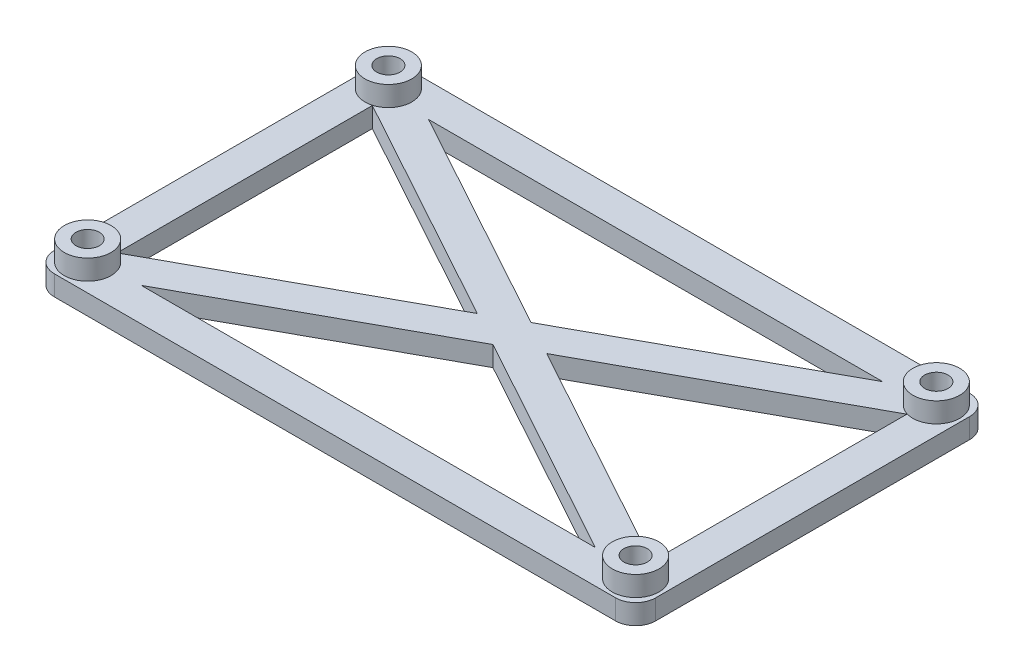
ISO-10303-21;
HEADER;
FILE_DESCRIPTION(('STEP AP214'),'2;1');
FILE_NAME('part.step','',(''),(''),'','','');
FILE_SCHEMA(('AUTOMOTIVE_DESIGN { 1 0 10303 214 1 1 1 1 }'));
ENDSEC;
DATA;
#1=APPLICATION_CONTEXT('core data for automotive mechanical design processes');
#2=APPLICATION_PROTOCOL_DEFINITION('international standard','automotive_design',2000,#1);
#3=PRODUCT_CONTEXT('',#1,'mechanical');
#4=PRODUCT('Part','Part','',(#3));
#5=PRODUCT_RELATED_PRODUCT_CATEGORY('part','',(#4));
#6=PRODUCT_DEFINITION_FORMATION('','',#4);
#7=PRODUCT_DEFINITION_CONTEXT('part definition',#1,'design');
#8=PRODUCT_DEFINITION('design','',#6,#7);
#9=PRODUCT_DEFINITION_SHAPE('','',#8);
#10=(LENGTH_UNIT() NAMED_UNIT(*) SI_UNIT(.MILLI.,.METRE.));
#11=(NAMED_UNIT(*) PLANE_ANGLE_UNIT() SI_UNIT($,.RADIAN.));
#12=(NAMED_UNIT(*) SI_UNIT($,.STERADIAN.) SOLID_ANGLE_UNIT());
#13=UNCERTAINTY_MEASURE_WITH_UNIT(LENGTH_MEASURE(1.E-05),#10,'distance_accuracy_value','');
#14=(GEOMETRIC_REPRESENTATION_CONTEXT(3) GLOBAL_UNCERTAINTY_ASSIGNED_CONTEXT((#13)) GLOBAL_UNIT_ASSIGNED_CONTEXT((#10,
#11,#12)) REPRESENTATION_CONTEXT('',''));
#15=CARTESIAN_POINT('',(0.,0.,0.));
#16=DIRECTION('',(0.,0.,1.));
#17=DIRECTION('',(1.,0.,0.));
#18=AXIS2_PLACEMENT_3D('',#15,#16,#17);
#19=CARTESIAN_POINT('',(-45.,3.,26.5));
#20=DIRECTION('',(1.,0.,0.));
#21=DIRECTION('',(0.,0.,-1.));
#22=AXIS2_PLACEMENT_3D('',#19,#20,#21);
#23=PLANE('',#22);
#24=DIRECTION('',(0.,0.,1.));
#25=VECTOR('',#24,1.);
#26=CARTESIAN_POINT('',(-45.,3.,26.5));
#27=LINE('',#26,#25);
#28=CARTESIAN_POINT('',(-45.,3.,-23.5));
#29=VERTEX_POINT('',#28);
#30=CARTESIAN_POINT('',(-45.,3.,23.5));
#31=VERTEX_POINT('',#30);
#32=EDGE_CURVE('E321',#29,#31,#27,.T.);
#33=ORIENTED_EDGE('',*,*,#32,.F.);
#34=DIRECTION('',(0.,-1.,0.));
#35=VECTOR('',#34,1.);
#36=CARTESIAN_POINT('',(-45.,3.,-23.5));
#37=LINE('',#36,#35);
#38=CARTESIAN_POINT('',(-45.,0.,-23.5));
#39=VERTEX_POINT('',#38);
#40=EDGE_CURVE('E376',#29,#39,#37,.T.);
#41=ORIENTED_EDGE('',*,*,#40,.T.);
#42=DIRECTION('',(0.,0.,1.));
#43=VECTOR('',#42,1.);
#44=CARTESIAN_POINT('',(-45.,0.,26.5));
#45=LINE('',#44,#43);
#46=CARTESIAN_POINT('',(-45.,0.,23.5));
#47=VERTEX_POINT('',#46);
#48=EDGE_CURVE('E319',#39,#47,#45,.T.);
#49=ORIENTED_EDGE('',*,*,#48,.T.);
#50=DIRECTION('',(0.,-1.,0.));
#51=VECTOR('',#50,1.);
#52=CARTESIAN_POINT('',(-45.,3.,23.5));
#53=LINE('',#52,#51);
#54=EDGE_CURVE('E372',#47,#31,#53,.F.);
#55=ORIENTED_EDGE('',*,*,#54,.T.);
#56=EDGE_LOOP('',(#33,#41,#49,#55));
#57=FACE_BOUND('',#56,.T.);
#58=ADVANCED_FACE('F50',(#57),#23,.F.);
#59=CARTESIAN_POINT('',(45.,3.,26.5));
#60=DIRECTION('',(0.,0.,-1.));
#61=DIRECTION('',(-1.,0.,0.));
#62=AXIS2_PLACEMENT_3D('',#59,#60,#61);
#63=PLANE('',#62);
#64=DIRECTION('',(1.,0.,0.));
#65=VECTOR('',#64,1.);
#66=CARTESIAN_POINT('',(45.,3.,26.5));
#67=LINE('',#66,#65);
#68=CARTESIAN_POINT('',(-42.,3.,26.5));
#69=VERTEX_POINT('',#68);
#70=CARTESIAN_POINT('',(42.,3.,26.5));
#71=VERTEX_POINT('',#70);
#72=EDGE_CURVE('E322',#69,#71,#67,.T.);
#73=ORIENTED_EDGE('',*,*,#72,.F.);
#74=DIRECTION('',(0.,-1.,0.));
#75=VECTOR('',#74,1.);
#76=CARTESIAN_POINT('',(-42.,3.,26.5));
#77=LINE('',#76,#75);
#78=CARTESIAN_POINT('',(-42.,0.,26.5));
#79=VERTEX_POINT('',#78);
#80=EDGE_CURVE('E11',#69,#79,#77,.T.);
#81=ORIENTED_EDGE('',*,*,#80,.T.);
#82=DIRECTION('',(1.,0.,0.));
#83=VECTOR('',#82,1.);
#84=CARTESIAN_POINT('',(45.,0.,26.5));
#85=LINE('',#84,#83);
#86=CARTESIAN_POINT('',(42.,0.,26.5));
#87=VERTEX_POINT('',#86);
#88=EDGE_CURVE('E333',#79,#87,#85,.T.);
#89=ORIENTED_EDGE('',*,*,#88,.T.);
#90=DIRECTION('',(0.,-1.,0.));
#91=VECTOR('',#90,1.);
#92=CARTESIAN_POINT('',(42.,3.,26.5));
#93=LINE('',#92,#91);
#94=EDGE_CURVE('E54',#87,#71,#93,.F.);
#95=ORIENTED_EDGE('',*,*,#94,.T.);
#96=EDGE_LOOP('',(#73,#81,#89,#95));
#97=FACE_BOUND('',#96,.T.);
#98=ADVANCED_FACE('F381',(#97),#63,.F.);
#99=CARTESIAN_POINT('',(45.,3.,26.5));
#100=DIRECTION('',(-1.,0.,0.));
#101=DIRECTION('',(0.,0.,1.));
#102=AXIS2_PLACEMENT_3D('',#99,#100,#101);
#103=PLANE('',#102);
#104=DIRECTION('',(0.,0.,-1.));
#105=VECTOR('',#104,1.);
#106=CARTESIAN_POINT('',(45.,0.,26.5));
#107=LINE('',#106,#105);
#108=CARTESIAN_POINT('',(45.,0.,23.5));
#109=VERTEX_POINT('',#108);
#110=CARTESIAN_POINT('',(45.,0.,-23.5));
#111=VERTEX_POINT('',#110);
#112=EDGE_CURVE('E336',#109,#111,#107,.T.);
#113=ORIENTED_EDGE('',*,*,#112,.T.);
#114=DIRECTION('',(0.,-1.,0.));
#115=VECTOR('',#114,1.);
#116=CARTESIAN_POINT('',(45.,3.,-23.5));
#117=LINE('',#116,#115);
#118=CARTESIAN_POINT('',(45.,3.,-23.5));
#119=VERTEX_POINT('',#118);
#120=EDGE_CURVE('E365',#111,#119,#117,.F.);
#121=ORIENTED_EDGE('',*,*,#120,.T.);
#122=DIRECTION('',(0.,0.,-1.));
#123=VECTOR('',#122,1.);
#124=CARTESIAN_POINT('',(45.,3.,26.5));
#125=LINE('',#124,#123);
#126=CARTESIAN_POINT('',(45.,3.,23.5));
#127=VERTEX_POINT('',#126);
#128=EDGE_CURVE('E327',#127,#119,#125,.T.);
#129=ORIENTED_EDGE('',*,*,#128,.F.);
#130=DIRECTION('',(0.,-1.,0.));
#131=VECTOR('',#130,1.);
#132=CARTESIAN_POINT('',(45.,3.,23.5));
#133=LINE('',#132,#131);
#134=EDGE_CURVE('E363',#127,#109,#133,.T.);
#135=ORIENTED_EDGE('',*,*,#134,.T.);
#136=EDGE_LOOP('',(#113,#121,#129,#135));
#137=FACE_BOUND('',#136,.T.);
#138=ADVANCED_FACE('F391',(#137),#103,.F.);
#139=CARTESIAN_POINT('',(45.,3.,-26.5));
#140=DIRECTION('',(0.,0.,1.));
#141=DIRECTION('',(1.,0.,0.));
#142=AXIS2_PLACEMENT_3D('',#139,#140,#141);
#143=PLANE('',#142);
#144=DIRECTION('',(-1.,0.,0.));
#145=VECTOR('',#144,1.);
#146=CARTESIAN_POINT('',(45.,3.,-26.5));
#147=LINE('',#146,#145);
#148=CARTESIAN_POINT('',(42.,3.,-26.5));
#149=VERTEX_POINT('',#148);
#150=CARTESIAN_POINT('',(-42.,3.,-26.5));
#151=VERTEX_POINT('',#150);
#152=EDGE_CURVE('E304',#149,#151,#147,.T.);
#153=ORIENTED_EDGE('',*,*,#152,.F.);
#154=DIRECTION('',(0.,-1.,0.));
#155=VECTOR('',#154,1.);
#156=CARTESIAN_POINT('',(42.,3.,-26.5));
#157=LINE('',#156,#155);
#158=CARTESIAN_POINT('',(42.,0.,-26.5));
#159=VERTEX_POINT('',#158);
#160=EDGE_CURVE('E348',#149,#159,#157,.T.);
#161=ORIENTED_EDGE('',*,*,#160,.T.);
#162=DIRECTION('',(-1.,0.,0.));
#163=VECTOR('',#162,1.);
#164=CARTESIAN_POINT('',(45.,0.,-26.5));
#165=LINE('',#164,#163);
#166=CARTESIAN_POINT('',(-42.,0.,-26.5));
#167=VERTEX_POINT('',#166);
#168=EDGE_CURVE('E324',#159,#167,#165,.T.);
#169=ORIENTED_EDGE('',*,*,#168,.T.);
#170=DIRECTION('',(0.,-1.,0.));
#171=VECTOR('',#170,1.);
#172=CARTESIAN_POINT('',(-42.,3.,-26.5));
#173=LINE('',#172,#171);
#174=EDGE_CURVE('E346',#167,#151,#173,.F.);
#175=ORIENTED_EDGE('',*,*,#174,.T.);
#176=EDGE_LOOP('',(#153,#161,#169,#175));
#177=FACE_BOUND('',#176,.T.);
#178=ADVANCED_FACE('F401',(#177),#143,.F.);
#179=CARTESIAN_POINT('',(0.,3.,0.));
#180=DIRECTION('',(0.,1.,0.));
#181=DIRECTION('',(0.,0.,1.));
#182=AXIS2_PLACEMENT_3D('',#179,#180,#181);
#183=PLANE('',#182);
#184=DIRECTION('',(0.,0.,1.));
#185=VECTOR('',#184,1.);
#186=CARTESIAN_POINT('',(-40.,3.,0.));
#187=LINE('',#186,#185);
#188=CARTESIAN_POINT('',(-40.,3.,-19.0995094728116));
#189=VERTEX_POINT('',#188);
#190=CARTESIAN_POINT('',(-40.,3.,19.0995094728116));
#191=VERTEX_POINT('',#190);
#192=EDGE_CURVE('E273',#189,#191,#187,.T.);
#193=ORIENTED_EDGE('',*,*,#192,.F.);
#194=DIRECTION('',(-0.876666970159564,0.,-0.481097727526591));
#195=VECTOR('',#194,1.);
#196=CARTESIAN_POINT('',(-1.20274431881648,3.,2.19166742539893));
#197=LINE('',#196,#195);
#198=CARTESIAN_POINT('',(-5.19644940509895,3.,0.));
#199=VERTEX_POINT('',#198);
#200=EDGE_CURVE('E269',#199,#189,#197,.T.);
#201=ORIENTED_EDGE('',*,*,#200,.F.);
#202=DIRECTION('',(0.876666970159564,0.,-0.48109772752659));
#203=VECTOR('',#202,1.);
#204=CARTESIAN_POINT('',(-1.20274431881648,3.,-2.19166742539892));
#205=LINE('',#204,#203);
#206=EDGE_CURVE('E275',#191,#199,#205,.T.);
#207=ORIENTED_EDGE('',*,*,#206,.F.);
#208=EDGE_LOOP('',(#193,#201,#207));
#209=FACE_BOUND('',#208,.T.);
#210=DIRECTION('',(0.,0.,-1.));
#211=VECTOR('',#210,1.);
#212=CARTESIAN_POINT('',(40.,3.,0.));
#213=LINE('',#212,#211);
#214=CARTESIAN_POINT('',(40.,3.,19.0995094728116));
#215=VERTEX_POINT('',#214);
#216=CARTESIAN_POINT('',(40.,3.,-19.0995094728116));
#217=VERTEX_POINT('',#216);
#218=EDGE_CURVE('E268',#215,#217,#213,.T.);
#219=ORIENTED_EDGE('',*,*,#218,.F.);
#220=DIRECTION('',(0.876666970159564,0.,0.481097727526591));
#221=VECTOR('',#220,1.);
#222=CARTESIAN_POINT('',(1.20274431881648,3.,-2.19166742539891));
#223=LINE('',#222,#221);
#224=CARTESIAN_POINT('',(5.19644940509894,3.,0.));
#225=VERTEX_POINT('',#224);
#226=EDGE_CURVE('E262',#225,#215,#223,.T.);
#227=ORIENTED_EDGE('',*,*,#226,.F.);
#228=DIRECTION('',(-0.876666970159565,0.,0.48109772752659));
#229=VECTOR('',#228,1.);
#230=CARTESIAN_POINT('',(1.20274431881648,3.,2.19166742539892));
#231=LINE('',#230,#229);
#232=EDGE_CURVE('E266',#217,#225,#231,.T.);
#233=ORIENTED_EDGE('',*,*,#232,.F.);
#234=EDGE_LOOP('',(#219,#227,#233));
#235=FACE_BOUND('',#234,.T.);
#236=DIRECTION('',(0.876666970159565,0.,0.48109772752659));
#237=VECTOR('',#236,1.);
#238=CARTESIAN_POINT('',(1.20274431881648,3.,-2.19166742539891));
#239=LINE('',#238,#237);
#240=CARTESIAN_POINT('',(-33.9813283726789,3.,-21.5));
#241=VERTEX_POINT('',#240);
#242=CARTESIAN_POINT('',(0.,3.,-2.85171003938356));
#243=VERTEX_POINT('',#242);
#244=EDGE_CURVE('E193',#241,#243,#239,.T.);
#245=ORIENTED_EDGE('',*,*,#244,.F.);
#246=DIRECTION('',(-1.,0.,0.));
#247=VECTOR('',#246,1.);
#248=CARTESIAN_POINT('',(0.,3.,-21.5));
#249=LINE('',#248,#247);
#250=CARTESIAN_POINT('',(33.9813283726789,3.,-21.5));
#251=VERTEX_POINT('',#250);
#252=EDGE_CURVE('E259',#251,#241,#249,.T.);
#253=ORIENTED_EDGE('',*,*,#252,.F.);
#254=DIRECTION('',(0.876666970159565,0.,-0.48109772752659));
#255=VECTOR('',#254,1.);
#256=CARTESIAN_POINT('',(-1.20274431881648,3.,-2.19166742539891));
#257=LINE('',#256,#255);
#258=EDGE_CURVE('E261',#243,#251,#257,.T.);
#259=ORIENTED_EDGE('',*,*,#258,.F.);
#260=EDGE_LOOP('',(#245,#253,#259));
#261=FACE_BOUND('',#260,.T.);
#262=DIRECTION('',(1.,0.,0.));
#263=VECTOR('',#262,1.);
#264=CARTESIAN_POINT('',(0.,3.,21.5));
#265=LINE('',#264,#263);
#266=CARTESIAN_POINT('',(-33.9813283726788,3.,21.5));
#267=VERTEX_POINT('',#266);
#268=CARTESIAN_POINT('',(33.9813283726788,3.,21.5));
#269=VERTEX_POINT('',#268);
#270=EDGE_CURVE('E260',#267,#269,#265,.T.);
#271=ORIENTED_EDGE('',*,*,#270,.F.);
#272=DIRECTION('',(-0.876666970159565,0.,0.48109772752659));
#273=VECTOR('',#272,1.);
#274=CARTESIAN_POINT('',(1.20274431881648,3.,2.19166742539891));
#275=LINE('',#274,#273);
#276=CARTESIAN_POINT('',(0.,3.,2.85171003938357));
#277=VERTEX_POINT('',#276);
#278=EDGE_CURVE('E246',#277,#267,#275,.T.);
#279=ORIENTED_EDGE('',*,*,#278,.F.);
#280=DIRECTION('',(-0.876666970159565,0.,-0.48109772752659));
#281=VECTOR('',#280,1.);
#282=CARTESIAN_POINT('',(-1.20274431881648,3.,2.19166742539892));
#283=LINE('',#282,#281);
#284=EDGE_CURVE('E255',#269,#277,#283,.T.);
#285=ORIENTED_EDGE('',*,*,#284,.F.);
#286=EDGE_LOOP('',(#271,#279,#285));
#287=FACE_BOUND('',#286,.T.);
#288=CARTESIAN_POINT('',(41.,3.,22.5));
#289=DIRECTION('',(0.,1.,0.));
#290=DIRECTION('',(0.,0.,1.));
#291=AXIS2_PLACEMENT_3D('',#288,#289,#290);
#292=CIRCLE('',#291,3.5);
#293=CARTESIAN_POINT('',(41.,3.,26.));
#294=VERTEX_POINT('',#293);
#295=EDGE_CURVE('E342',#294,#294,#292,.T.);
#296=ORIENTED_EDGE('',*,*,#295,.F.);
#297=EDGE_LOOP('',(#296));
#298=FACE_BOUND('',#297,.T.);
#299=CARTESIAN_POINT('',(-41.,3.,22.5));
#300=DIRECTION('',(0.,1.,0.));
#301=DIRECTION('',(0.,0.,1.));
#302=AXIS2_PLACEMENT_3D('',#299,#300,#301);
#303=CIRCLE('',#302,3.5);
#304=CARTESIAN_POINT('',(-41.,3.,26.));
#305=VERTEX_POINT('',#304);
#306=EDGE_CURVE('E299',#305,#305,#303,.T.);
#307=ORIENTED_EDGE('',*,*,#306,.F.);
#308=EDGE_LOOP('',(#307));
#309=FACE_BOUND('',#308,.T.);
#310=CARTESIAN_POINT('',(41.,3.,-22.5));
#311=DIRECTION('',(0.,1.,0.));
#312=DIRECTION('',(0.,0.,1.));
#313=AXIS2_PLACEMENT_3D('',#310,#311,#312);
#314=CIRCLE('',#313,3.5);
#315=CARTESIAN_POINT('',(41.,3.,-19.));
#316=VERTEX_POINT('',#315);
#317=EDGE_CURVE('E300',#316,#316,#314,.T.);
#318=ORIENTED_EDGE('',*,*,#317,.F.);
#319=EDGE_LOOP('',(#318));
#320=FACE_BOUND('',#319,.T.);
#321=CARTESIAN_POINT('',(-41.,3.,-22.5));
#322=DIRECTION('',(0.,1.,0.));
#323=DIRECTION('',(0.,0.,1.));
#324=AXIS2_PLACEMENT_3D('',#321,#322,#323);
#325=CIRCLE('',#324,3.5);
#326=CARTESIAN_POINT('',(-41.,3.,-19.));
#327=VERTEX_POINT('',#326);
#328=EDGE_CURVE('E303',#327,#327,#325,.T.);
#329=ORIENTED_EDGE('',*,*,#328,.F.);
#330=EDGE_LOOP('',(#329));
#331=FACE_BOUND('',#330,.T.);
#332=ORIENTED_EDGE('',*,*,#128,.T.);
#333=CARTESIAN_POINT('',(42.,3.,-23.5));
#334=DIRECTION('',(0.,1.,0.));
#335=DIRECTION('',(0.,0.,1.));
#336=AXIS2_PLACEMENT_3D('',#333,#334,#335);
#337=CIRCLE('',#336,3.);
#338=EDGE_CURVE('E375',#119,#149,#337,.T.);
#339=ORIENTED_EDGE('',*,*,#338,.T.);
#340=ORIENTED_EDGE('',*,*,#152,.T.);
#341=CARTESIAN_POINT('',(-42.,3.,-23.5));
#342=DIRECTION('',(0.,1.,0.));
#343=DIRECTION('',(0.,0.,1.));
#344=AXIS2_PLACEMENT_3D('',#341,#342,#343);
#345=CIRCLE('',#344,3.);
#346=EDGE_CURVE('E367',#151,#29,#345,.T.);
#347=ORIENTED_EDGE('',*,*,#346,.T.);
#348=ORIENTED_EDGE('',*,*,#32,.T.);
#349=CARTESIAN_POINT('',(-42.,3.,23.5));
#350=DIRECTION('',(0.,1.,0.));
#351=DIRECTION('',(0.,0.,1.));
#352=AXIS2_PLACEMENT_3D('',#349,#350,#351);
#353=CIRCLE('',#352,3.);
#354=EDGE_CURVE('E366',#31,#69,#353,.T.);
#355=ORIENTED_EDGE('',*,*,#354,.T.);
#356=ORIENTED_EDGE('',*,*,#72,.T.);
#357=CARTESIAN_POINT('',(42.,3.,23.5));
#358=DIRECTION('',(0.,1.,0.));
#359=DIRECTION('',(0.,0.,1.));
#360=AXIS2_PLACEMENT_3D('',#357,#358,#359);
#361=CIRCLE('',#360,3.);
#362=EDGE_CURVE('E368',#71,#127,#361,.T.);
#363=ORIENTED_EDGE('',*,*,#362,.T.);
#364=EDGE_LOOP('',(#332,#339,#340,#347,#348,#355,#356,#363));
#365=FACE_BOUND('',#364,.T.);
#366=ADVANCED_FACE('F390',(#209,#235,#261,#287,#298,#309,#320,#331,#365),#183,.T.);
#367=CARTESIAN_POINT('',(0.,0.,0.));
#368=DIRECTION('',(0.,1.,0.));
#369=DIRECTION('',(0.,0.,1.));
#370=AXIS2_PLACEMENT_3D('',#367,#368,#369);
#371=PLANE('',#370);
#372=DIRECTION('',(0.876666970159564,0.,0.481097727526591));
#373=VECTOR('',#372,1.);
#374=CARTESIAN_POINT('',(-5.19644940509895,0.,0.));
#375=LINE('',#374,#373);
#376=CARTESIAN_POINT('',(-40.,0.,-19.0995094728116));
#377=VERTEX_POINT('',#376);
#378=CARTESIAN_POINT('',(-5.19644940509895,0.,0.));
#379=VERTEX_POINT('',#378);
#380=EDGE_CURVE('E224',#377,#379,#375,.T.);
#381=ORIENTED_EDGE('',*,*,#380,.F.);
#382=DIRECTION('',(0.,0.,-1.));
#383=VECTOR('',#382,1.);
#384=CARTESIAN_POINT('',(-40.,0.,-19.0995094728116));
#385=LINE('',#384,#383);
#386=CARTESIAN_POINT('',(-40.,0.,19.0995094728116));
#387=VERTEX_POINT('',#386);
#388=EDGE_CURVE('E223',#387,#377,#385,.T.);
#389=ORIENTED_EDGE('',*,*,#388,.F.);
#390=DIRECTION('',(-0.876666970159564,0.,0.48109772752659));
#391=VECTOR('',#390,1.);
#392=CARTESIAN_POINT('',(-40.,0.,19.0995094728116));
#393=LINE('',#392,#391);
#394=EDGE_CURVE('E216',#379,#387,#393,.T.);
#395=ORIENTED_EDGE('',*,*,#394,.F.);
#396=EDGE_LOOP('',(#381,#389,#395));
#397=FACE_BOUND('',#396,.T.);
#398=DIRECTION('',(-0.876666970159564,0.,-0.481097727526591));
#399=VECTOR('',#398,1.);
#400=CARTESIAN_POINT('',(40.,0.,19.0995094728116));
#401=LINE('',#400,#399);
#402=CARTESIAN_POINT('',(40.,0.,19.0995094728116));
#403=VERTEX_POINT('',#402);
#404=CARTESIAN_POINT('',(5.19644940509894,0.,0.));
#405=VERTEX_POINT('',#404);
#406=EDGE_CURVE('E232',#403,#405,#401,.T.);
#407=ORIENTED_EDGE('',*,*,#406,.F.);
#408=DIRECTION('',(0.,0.,1.));
#409=VECTOR('',#408,1.);
#410=CARTESIAN_POINT('',(40.,0.,19.0995094728116));
#411=LINE('',#410,#409);
#412=CARTESIAN_POINT('',(40.,0.,-19.0995094728116));
#413=VERTEX_POINT('',#412);
#414=EDGE_CURVE('E219',#413,#403,#411,.T.);
#415=ORIENTED_EDGE('',*,*,#414,.F.);
#416=DIRECTION('',(0.876666970159565,0.,-0.48109772752659));
#417=VECTOR('',#416,1.);
#418=CARTESIAN_POINT('',(5.19644940509894,0.,0.));
#419=LINE('',#418,#417);
#420=EDGE_CURVE('E233',#405,#413,#419,.T.);
#421=ORIENTED_EDGE('',*,*,#420,.F.);
#422=EDGE_LOOP('',(#407,#415,#421));
#423=FACE_BOUND('',#422,.T.);
#424=DIRECTION('',(1.,0.,0.));
#425=VECTOR('',#424,1.);
#426=CARTESIAN_POINT('',(33.9813283726789,0.,-21.5));
#427=LINE('',#426,#425);
#428=CARTESIAN_POINT('',(-33.9813283726789,0.,-21.5));
#429=VERTEX_POINT('',#428);
#430=CARTESIAN_POINT('',(33.9813283726789,0.,-21.5));
#431=VERTEX_POINT('',#430);
#432=EDGE_CURVE('E201',#429,#431,#427,.T.);
#433=ORIENTED_EDGE('',*,*,#432,.F.);
#434=DIRECTION('',(-0.876666970159565,0.,-0.48109772752659));
#435=VECTOR('',#434,1.);
#436=CARTESIAN_POINT('',(0.,0.,-2.85171003938356));
#437=LINE('',#436,#435);
#438=CARTESIAN_POINT('',(0.,0.,-2.85171003938356));
#439=VERTEX_POINT('',#438);
#440=EDGE_CURVE('E186',#439,#429,#437,.T.);
#441=ORIENTED_EDGE('',*,*,#440,.F.);
#442=DIRECTION('',(-0.876666970159564,0.,0.48109772752659));
#443=VECTOR('',#442,1.);
#444=CARTESIAN_POINT('',(0.,0.,-2.85171003938356));
#445=LINE('',#444,#443);
#446=EDGE_CURVE('E196',#431,#439,#445,.T.);
#447=ORIENTED_EDGE('',*,*,#446,.F.);
#448=EDGE_LOOP('',(#433,#441,#447));
#449=FACE_BOUND('',#448,.T.);
#450=DIRECTION('',(0.876666970159564,0.,-0.48109772752659));
#451=VECTOR('',#450,1.);
#452=CARTESIAN_POINT('',(-33.9813283726788,0.,21.5));
#453=LINE('',#452,#451);
#454=CARTESIAN_POINT('',(-33.9813283726788,0.,21.5));
#455=VERTEX_POINT('',#454);
#456=CARTESIAN_POINT('',(0.,0.,2.85171003938357));
#457=VERTEX_POINT('',#456);
#458=EDGE_CURVE('E239',#455,#457,#453,.T.);
#459=ORIENTED_EDGE('',*,*,#458,.F.);
#460=DIRECTION('',(-1.,0.,0.));
#461=VECTOR('',#460,1.);
#462=CARTESIAN_POINT('',(-33.9813283726788,0.,21.5));
#463=LINE('',#462,#461);
#464=CARTESIAN_POINT('',(33.9813283726788,0.,21.5));
#465=VERTEX_POINT('',#464);
#466=EDGE_CURVE('E230',#465,#455,#463,.T.);
#467=ORIENTED_EDGE('',*,*,#466,.F.);
#468=DIRECTION('',(0.876666970159564,0.,0.48109772752659));
#469=VECTOR('',#468,1.);
#470=CARTESIAN_POINT('',(33.9813283726788,0.,21.5));
#471=LINE('',#470,#469);
#472=EDGE_CURVE('E245',#457,#465,#471,.T.);
#473=ORIENTED_EDGE('',*,*,#472,.F.);
#474=EDGE_LOOP('',(#459,#467,#473));
#475=FACE_BOUND('',#474,.T.);
#476=CARTESIAN_POINT('',(-41.,0.,-22.5));
#477=DIRECTION('',(0.,-1.,0.));
#478=DIRECTION('',(0.,0.,-1.));
#479=AXIS2_PLACEMENT_3D('',#476,#477,#478);
#480=CIRCLE('',#479,1.75);
#481=CARTESIAN_POINT('',(-41.,0.,-24.25));
#482=VERTEX_POINT('',#481);
#483=EDGE_CURVE('E298',#482,#482,#480,.T.);
#484=ORIENTED_EDGE('',*,*,#483,.F.);
#485=EDGE_LOOP('',(#484));
#486=FACE_BOUND('',#485,.T.);
#487=CARTESIAN_POINT('',(-41.,0.,22.5));
#488=DIRECTION('',(0.,-1.,0.));
#489=DIRECTION('',(0.,0.,-1.));
#490=AXIS2_PLACEMENT_3D('',#487,#488,#489);
#491=CIRCLE('',#490,1.75);
#492=CARTESIAN_POINT('',(-41.,0.,20.75));
#493=VERTEX_POINT('',#492);
#494=EDGE_CURVE('E311',#493,#493,#491,.T.);
#495=ORIENTED_EDGE('',*,*,#494,.F.);
#496=EDGE_LOOP('',(#495));
#497=FACE_BOUND('',#496,.T.);
#498=CARTESIAN_POINT('',(41.,0.,22.5));
#499=DIRECTION('',(0.,-1.,0.));
#500=DIRECTION('',(0.,0.,-1.));
#501=AXIS2_PLACEMENT_3D('',#498,#499,#500);
#502=CIRCLE('',#501,1.75);
#503=CARTESIAN_POINT('',(41.,0.,20.75));
#504=VERTEX_POINT('',#503);
#505=EDGE_CURVE('E310',#504,#504,#502,.T.);
#506=ORIENTED_EDGE('',*,*,#505,.F.);
#507=EDGE_LOOP('',(#506));
#508=FACE_BOUND('',#507,.T.);
#509=CARTESIAN_POINT('',(41.,0.,-22.5));
#510=DIRECTION('',(0.,-1.,0.));
#511=DIRECTION('',(0.,0.,-1.));
#512=AXIS2_PLACEMENT_3D('',#509,#510,#511);
#513=CIRCLE('',#512,1.75);
#514=CARTESIAN_POINT('',(41.,0.,-24.25));
#515=VERTEX_POINT('',#514);
#516=EDGE_CURVE('E315',#515,#515,#513,.T.);
#517=ORIENTED_EDGE('',*,*,#516,.F.);
#518=EDGE_LOOP('',(#517));
#519=FACE_BOUND('',#518,.T.);
#520=ORIENTED_EDGE('',*,*,#168,.F.);
#521=CARTESIAN_POINT('',(42.,0.,-23.5));
#522=DIRECTION('',(0.,1.,0.));
#523=DIRECTION('',(0.,0.,1.));
#524=AXIS2_PLACEMENT_3D('',#521,#522,#523);
#525=CIRCLE('',#524,3.);
#526=EDGE_CURVE('E359',#159,#111,#525,.F.);
#527=ORIENTED_EDGE('',*,*,#526,.T.);
#528=ORIENTED_EDGE('',*,*,#112,.F.);
#529=CARTESIAN_POINT('',(42.,0.,23.5));
#530=DIRECTION('',(0.,1.,0.));
#531=DIRECTION('',(0.,0.,1.));
#532=AXIS2_PLACEMENT_3D('',#529,#530,#531);
#533=CIRCLE('',#532,3.);
#534=EDGE_CURVE('E351',#109,#87,#533,.F.);
#535=ORIENTED_EDGE('',*,*,#534,.T.);
#536=ORIENTED_EDGE('',*,*,#88,.F.);
#537=CARTESIAN_POINT('',(-42.,0.,23.5));
#538=DIRECTION('',(0.,1.,0.));
#539=DIRECTION('',(0.,0.,1.));
#540=AXIS2_PLACEMENT_3D('',#537,#538,#539);
#541=CIRCLE('',#540,3.);
#542=EDGE_CURVE('E354',#79,#47,#541,.F.);
#543=ORIENTED_EDGE('',*,*,#542,.T.);
#544=ORIENTED_EDGE('',*,*,#48,.F.);
#545=CARTESIAN_POINT('',(-42.,0.,-23.5));
#546=DIRECTION('',(0.,1.,0.));
#547=DIRECTION('',(0.,0.,1.));
#548=AXIS2_PLACEMENT_3D('',#545,#546,#547);
#549=CIRCLE('',#548,3.);
#550=EDGE_CURVE('E360',#39,#167,#549,.F.);
#551=ORIENTED_EDGE('',*,*,#550,.T.);
#552=EDGE_LOOP('',(#520,#527,#528,#535,#536,#543,#544,#551));
#553=FACE_BOUND('',#552,.T.);
#554=ADVANCED_FACE('F206',(#397,#423,#449,#475,#486,#497,#508,#519,#553),#371,.F.);
#555=CARTESIAN_POINT('',(41.,3.,-22.5));
#556=DIRECTION('',(0.,-1.,0.));
#557=DIRECTION('',(0.,0.,-1.));
#558=AXIS2_PLACEMENT_3D('',#555,#556,#557);
#559=CYLINDRICAL_SURFACE('',#558,1.75);
#560=ORIENTED_EDGE('',*,*,#516,.T.);
#561=EDGE_LOOP('',(#560));
#562=FACE_BOUND('',#561,.T.);
#563=CARTESIAN_POINT('',(41.,6.,-22.5));
#564=DIRECTION('',(0.,1.,0.));
#565=DIRECTION('',(0.,0.,1.));
#566=AXIS2_PLACEMENT_3D('',#563,#564,#565);
#567=CIRCLE('',#566,1.75);
#568=CARTESIAN_POINT('',(41.,6.,-20.75));
#569=VERTEX_POINT('',#568);
#570=EDGE_CURVE('E289',#569,#569,#567,.T.);
#571=ORIENTED_EDGE('',*,*,#570,.T.);
#572=EDGE_LOOP('',(#571));
#573=FACE_BOUND('',#572,.T.);
#574=ADVANCED_FACE('F480',(#562,#573),#559,.F.);
#575=CARTESIAN_POINT('',(41.,3.,22.5));
#576=DIRECTION('',(0.,-1.,0.));
#577=DIRECTION('',(0.,0.,-1.));
#578=AXIS2_PLACEMENT_3D('',#575,#576,#577);
#579=CYLINDRICAL_SURFACE('',#578,1.75);
#580=ORIENTED_EDGE('',*,*,#505,.T.);
#581=EDGE_LOOP('',(#580));
#582=FACE_BOUND('',#581,.T.);
#583=CARTESIAN_POINT('',(41.,6.,22.5));
#584=DIRECTION('',(0.,-1.,0.));
#585=DIRECTION('',(0.,0.,-1.));
#586=AXIS2_PLACEMENT_3D('',#583,#584,#585);
#587=CIRCLE('',#586,1.75);
#588=CARTESIAN_POINT('',(41.,6.,20.75));
#589=VERTEX_POINT('',#588);
#590=EDGE_CURVE('E280',#589,#589,#587,.T.);
#591=ORIENTED_EDGE('',*,*,#590,.F.);
#592=EDGE_LOOP('',(#591));
#593=FACE_BOUND('',#592,.T.);
#594=ADVANCED_FACE('F471',(#582,#593),#579,.F.);
#595=CARTESIAN_POINT('',(-41.,3.,22.5));
#596=DIRECTION('',(0.,-1.,0.));
#597=DIRECTION('',(0.,0.,-1.));
#598=AXIS2_PLACEMENT_3D('',#595,#596,#597);
#599=CYLINDRICAL_SURFACE('',#598,1.75);
#600=ORIENTED_EDGE('',*,*,#494,.T.);
#601=EDGE_LOOP('',(#600));
#602=FACE_BOUND('',#601,.T.);
#603=CARTESIAN_POINT('',(-41.,6.,22.5));
#604=DIRECTION('',(0.,-1.,0.));
#605=DIRECTION('',(0.,0.,-1.));
#606=AXIS2_PLACEMENT_3D('',#603,#604,#605);
#607=CIRCLE('',#606,1.75);
#608=CARTESIAN_POINT('',(-41.,6.,20.75));
#609=VERTEX_POINT('',#608);
#610=EDGE_CURVE('E277',#609,#609,#607,.T.);
#611=ORIENTED_EDGE('',*,*,#610,.F.);
#612=EDGE_LOOP('',(#611));
#613=FACE_BOUND('',#612,.T.);
#614=ADVANCED_FACE('F478',(#602,#613),#599,.F.);
#615=CARTESIAN_POINT('',(-41.,3.,-22.5));
#616=DIRECTION('',(0.,-1.,0.));
#617=DIRECTION('',(0.,0.,-1.));
#618=AXIS2_PLACEMENT_3D('',#615,#616,#617);
#619=CYLINDRICAL_SURFACE('',#618,1.75);
#620=ORIENTED_EDGE('',*,*,#483,.T.);
#621=EDGE_LOOP('',(#620));
#622=FACE_BOUND('',#621,.T.);
#623=CARTESIAN_POINT('',(-41.,6.,-22.5));
#624=DIRECTION('',(0.,1.,0.));
#625=DIRECTION('',(0.,0.,1.));
#626=AXIS2_PLACEMENT_3D('',#623,#624,#625);
#627=CIRCLE('',#626,1.75);
#628=CARTESIAN_POINT('',(-41.,6.,-20.75));
#629=VERTEX_POINT('',#628);
#630=EDGE_CURVE('E291',#629,#629,#627,.T.);
#631=ORIENTED_EDGE('',*,*,#630,.T.);
#632=EDGE_LOOP('',(#631));
#633=FACE_BOUND('',#632,.T.);
#634=ADVANCED_FACE('F473',(#622,#633),#619,.F.);
#635=CARTESIAN_POINT('',(-41.,6.,-22.5));
#636=DIRECTION('',(0.,1.,0.));
#637=DIRECTION('',(0.,0.,1.));
#638=AXIS2_PLACEMENT_3D('',#635,#636,#637);
#639=PLANE('',#638);
#640=CARTESIAN_POINT('',(-41.,6.,-22.5));
#641=DIRECTION('',(0.,1.,0.));
#642=DIRECTION('',(0.,0.,1.));
#643=AXIS2_PLACEMENT_3D('',#640,#641,#642);
#644=CIRCLE('',#643,3.5);
#645=CARTESIAN_POINT('',(-41.,6.,-19.));
#646=VERTEX_POINT('',#645);
#647=EDGE_CURVE('E282',#646,#646,#644,.T.);
#648=ORIENTED_EDGE('',*,*,#647,.T.);
#649=EDGE_LOOP('',(#648));
#650=FACE_BOUND('',#649,.T.);
#651=ORIENTED_EDGE('',*,*,#630,.F.);
#652=EDGE_LOOP('',(#651));
#653=FACE_BOUND('',#652,.T.);
#654=ADVANCED_FACE('F470',(#650,#653),#639,.T.);
#655=CARTESIAN_POINT('',(-41.,6.,-22.5));
#656=DIRECTION('',(0.,-1.,0.));
#657=DIRECTION('',(0.,0.,-1.));
#658=AXIS2_PLACEMENT_3D('',#655,#656,#657);
#659=CYLINDRICAL_SURFACE('',#658,3.5);
#660=ORIENTED_EDGE('',*,*,#647,.F.);
#661=EDGE_LOOP('',(#660));
#662=FACE_BOUND('',#661,.T.);
#663=ORIENTED_EDGE('',*,*,#328,.T.);
#664=EDGE_LOOP('',(#663));
#665=FACE_BOUND('',#664,.T.);
#666=ADVANCED_FACE('F458',(#662,#665),#659,.T.);
#667=CARTESIAN_POINT('',(41.,6.,-22.5));
#668=DIRECTION('',(0.,1.,0.));
#669=DIRECTION('',(0.,0.,1.));
#670=AXIS2_PLACEMENT_3D('',#667,#668,#669);
#671=PLANE('',#670);
#672=CARTESIAN_POINT('',(41.,6.,-22.5));
#673=DIRECTION('',(0.,1.,0.));
#674=DIRECTION('',(0.,0.,1.));
#675=AXIS2_PLACEMENT_3D('',#672,#673,#674);
#676=CIRCLE('',#675,3.5);
#677=CARTESIAN_POINT('',(41.,6.,-19.));
#678=VERTEX_POINT('',#677);
#679=EDGE_CURVE('E295',#678,#678,#676,.T.);
#680=ORIENTED_EDGE('',*,*,#679,.T.);
#681=EDGE_LOOP('',(#680));
#682=FACE_BOUND('',#681,.T.);
#683=ORIENTED_EDGE('',*,*,#570,.F.);
#684=EDGE_LOOP('',(#683));
#685=FACE_BOUND('',#684,.T.);
#686=ADVANCED_FACE('F460',(#682,#685),#671,.T.);
#687=CARTESIAN_POINT('',(41.,6.,-22.5));
#688=DIRECTION('',(0.,-1.,0.));
#689=DIRECTION('',(0.,0.,-1.));
#690=AXIS2_PLACEMENT_3D('',#687,#688,#689);
#691=CYLINDRICAL_SURFACE('',#690,3.5);
#692=ORIENTED_EDGE('',*,*,#679,.F.);
#693=EDGE_LOOP('',(#692));
#694=FACE_BOUND('',#693,.T.);
#695=ORIENTED_EDGE('',*,*,#317,.T.);
#696=EDGE_LOOP('',(#695));
#697=FACE_BOUND('',#696,.T.);
#698=ADVANCED_FACE('F452',(#694,#697),#691,.T.);
#699=CARTESIAN_POINT('',(-41.,6.,22.5));
#700=DIRECTION('',(0.,-1.,0.));
#701=DIRECTION('',(0.,0.,-1.));
#702=AXIS2_PLACEMENT_3D('',#699,#700,#701);
#703=CYLINDRICAL_SURFACE('',#702,3.5);
#704=CARTESIAN_POINT('',(-41.,6.,22.5));
#705=DIRECTION('',(0.,-1.,0.));
#706=DIRECTION('',(0.,0.,-1.));
#707=AXIS2_PLACEMENT_3D('',#704,#705,#706);
#708=CIRCLE('',#707,3.5);
#709=CARTESIAN_POINT('',(-41.,6.,19.));
#710=VERTEX_POINT('',#709);
#711=EDGE_CURVE('E283',#710,#710,#708,.T.);
#712=ORIENTED_EDGE('',*,*,#711,.T.);
#713=EDGE_LOOP('',(#712));
#714=FACE_BOUND('',#713,.T.);
#715=ORIENTED_EDGE('',*,*,#306,.T.);
#716=EDGE_LOOP('',(#715));
#717=FACE_BOUND('',#716,.T.);
#718=ADVANCED_FACE('F453',(#714,#717),#703,.T.);
#719=CARTESIAN_POINT('',(-41.,6.,22.5));
#720=DIRECTION('',(0.,1.,0.));
#721=DIRECTION('',(0.,0.,-1.));
#722=AXIS2_PLACEMENT_3D('',#719,#720,#721);
#723=PLANE('',#722);
#724=ORIENTED_EDGE('',*,*,#610,.T.);
#725=EDGE_LOOP('',(#724));
#726=FACE_BOUND('',#725,.T.);
#727=ORIENTED_EDGE('',*,*,#711,.F.);
#728=EDGE_LOOP('',(#727));
#729=FACE_BOUND('',#728,.T.);
#730=ADVANCED_FACE('F445',(#726,#729),#723,.T.);
#731=CARTESIAN_POINT('',(41.,6.,22.5));
#732=DIRECTION('',(0.,-1.,0.));
#733=DIRECTION('',(0.,0.,-1.));
#734=AXIS2_PLACEMENT_3D('',#731,#732,#733);
#735=CYLINDRICAL_SURFACE('',#734,3.5);
#736=CARTESIAN_POINT('',(41.,6.,22.5));
#737=DIRECTION('',(0.,-1.,0.));
#738=DIRECTION('',(0.,0.,-1.));
#739=AXIS2_PLACEMENT_3D('',#736,#737,#738);
#740=CIRCLE('',#739,3.5);
#741=CARTESIAN_POINT('',(41.,6.,19.));
#742=VERTEX_POINT('',#741);
#743=EDGE_CURVE('E278',#742,#742,#740,.T.);
#744=ORIENTED_EDGE('',*,*,#743,.T.);
#745=EDGE_LOOP('',(#744));
#746=FACE_BOUND('',#745,.T.);
#747=ORIENTED_EDGE('',*,*,#295,.T.);
#748=EDGE_LOOP('',(#747));
#749=FACE_BOUND('',#748,.T.);
#750=ADVANCED_FACE('F436',(#746,#749),#735,.T.);
#751=CARTESIAN_POINT('',(41.,6.,22.5));
#752=DIRECTION('',(0.,1.,0.));
#753=DIRECTION('',(0.,0.,-1.));
#754=AXIS2_PLACEMENT_3D('',#751,#752,#753);
#755=PLANE('',#754);
#756=ORIENTED_EDGE('',*,*,#590,.T.);
#757=EDGE_LOOP('',(#756));
#758=FACE_BOUND('',#757,.T.);
#759=ORIENTED_EDGE('',*,*,#743,.F.);
#760=EDGE_LOOP('',(#759));
#761=FACE_BOUND('',#760,.T.);
#762=ADVANCED_FACE('F435',(#758,#761),#755,.T.);
#763=CARTESIAN_POINT('',(42.,3.,-23.5));
#764=DIRECTION('',(0.,-1.,0.));
#765=DIRECTION('',(0.,0.,-1.));
#766=AXIS2_PLACEMENT_3D('',#763,#764,#765);
#767=CYLINDRICAL_SURFACE('',#766,3.);
#768=ORIENTED_EDGE('',*,*,#338,.F.);
#769=ORIENTED_EDGE('',*,*,#120,.F.);
#770=ORIENTED_EDGE('',*,*,#526,.F.);
#771=ORIENTED_EDGE('',*,*,#160,.F.);
#772=EDGE_LOOP('',(#768,#769,#770,#771));
#773=FACE_BOUND('',#772,.T.);
#774=ADVANCED_FACE('F397',(#773),#767,.T.);
#775=CARTESIAN_POINT('',(-42.,3.,-23.5));
#776=DIRECTION('',(0.,-1.,0.));
#777=DIRECTION('',(0.,0.,-1.));
#778=AXIS2_PLACEMENT_3D('',#775,#776,#777);
#779=CYLINDRICAL_SURFACE('',#778,3.);
#780=ORIENTED_EDGE('',*,*,#346,.F.);
#781=ORIENTED_EDGE('',*,*,#174,.F.);
#782=ORIENTED_EDGE('',*,*,#550,.F.);
#783=ORIENTED_EDGE('',*,*,#40,.F.);
#784=EDGE_LOOP('',(#780,#781,#782,#783));
#785=FACE_BOUND('',#784,.T.);
#786=ADVANCED_FACE('F407',(#785),#779,.T.);
#787=CARTESIAN_POINT('',(-42.,3.,23.5));
#788=DIRECTION('',(0.,-1.,0.));
#789=DIRECTION('',(0.,0.,-1.));
#790=AXIS2_PLACEMENT_3D('',#787,#788,#789);
#791=CYLINDRICAL_SURFACE('',#790,3.);
#792=ORIENTED_EDGE('',*,*,#354,.F.);
#793=ORIENTED_EDGE('',*,*,#54,.F.);
#794=ORIENTED_EDGE('',*,*,#542,.F.);
#795=ORIENTED_EDGE('',*,*,#80,.F.);
#796=EDGE_LOOP('',(#792,#793,#794,#795));
#797=FACE_BOUND('',#796,.T.);
#798=ADVANCED_FACE('F414',(#797),#791,.T.);
#799=CARTESIAN_POINT('',(42.,3.,23.5));
#800=DIRECTION('',(0.,-1.,0.));
#801=DIRECTION('',(0.,0.,-1.));
#802=AXIS2_PLACEMENT_3D('',#799,#800,#801);
#803=CYLINDRICAL_SURFACE('',#802,3.);
#804=ORIENTED_EDGE('',*,*,#362,.F.);
#805=ORIENTED_EDGE('',*,*,#94,.F.);
#806=ORIENTED_EDGE('',*,*,#534,.F.);
#807=ORIENTED_EDGE('',*,*,#134,.F.);
#808=EDGE_LOOP('',(#804,#805,#806,#807));
#809=FACE_BOUND('',#808,.T.);
#810=ADVANCED_FACE('F47',(#809),#803,.T.);
#811=CARTESIAN_POINT('',(-33.9813283726788,6.,21.5));
#812=DIRECTION('',(0.,0.,1.));
#813=DIRECTION('',(1.,0.,0.));
#814=AXIS2_PLACEMENT_3D('',#811,#812,#813);
#815=PLANE('',#814);
#816=ORIENTED_EDGE('',*,*,#270,.T.);
#817=DIRECTION('',(0.,-1.,0.));
#818=VECTOR('',#817,1.);
#819=CARTESIAN_POINT('',(33.9813283726788,6.,21.5));
#820=LINE('',#819,#818);
#821=EDGE_CURVE('E248',#269,#465,#820,.T.);
#822=ORIENTED_EDGE('',*,*,#821,.T.);
#823=ORIENTED_EDGE('',*,*,#466,.T.);
#824=DIRECTION('',(0.,-1.,0.));
#825=VECTOR('',#824,1.);
#826=CARTESIAN_POINT('',(-33.9813283726788,6.,21.5));
#827=LINE('',#826,#825);
#828=EDGE_CURVE('E244',#267,#455,#827,.T.);
#829=ORIENTED_EDGE('',*,*,#828,.F.);
#830=EDGE_LOOP('',(#816,#822,#823,#829));
#831=FACE_BOUND('',#830,.T.);
#832=ADVANCED_FACE('F419',(#831),#815,.F.);
#833=CARTESIAN_POINT('',(33.9813283726788,6.,21.5));
#834=DIRECTION('',(0.48109772752659,0.,-0.876666970159564));
#835=DIRECTION('',(-0.876666970159565,0.,-0.48109772752659));
#836=AXIS2_PLACEMENT_3D('',#833,#834,#835);
#837=PLANE('',#836);
#838=ORIENTED_EDGE('',*,*,#284,.T.);
#839=DIRECTION('',(0.,-1.,0.));
#840=VECTOR('',#839,1.);
#841=CARTESIAN_POINT('',(0.,6.,2.85171003938357));
#842=LINE('',#841,#840);
#843=EDGE_CURVE('E249',#277,#457,#842,.T.);
#844=ORIENTED_EDGE('',*,*,#843,.T.);
#845=ORIENTED_EDGE('',*,*,#472,.T.);
#846=ORIENTED_EDGE('',*,*,#821,.F.);
#847=EDGE_LOOP('',(#838,#844,#845,#846));
#848=FACE_BOUND('',#847,.T.);
#849=ADVANCED_FACE('F623',(#848),#837,.F.);
#850=CARTESIAN_POINT('',(-33.9813283726788,6.,21.5));
#851=DIRECTION('',(-0.48109772752659,0.,-0.876666970159564));
#852=DIRECTION('',(-0.876666970159565,0.,0.48109772752659));
#853=AXIS2_PLACEMENT_3D('',#850,#851,#852);
#854=PLANE('',#853);
#855=ORIENTED_EDGE('',*,*,#278,.T.);
#856=ORIENTED_EDGE('',*,*,#828,.T.);
#857=ORIENTED_EDGE('',*,*,#458,.T.);
#858=ORIENTED_EDGE('',*,*,#843,.F.);
#859=EDGE_LOOP('',(#855,#856,#857,#858));
#860=FACE_BOUND('',#859,.T.);
#861=ADVANCED_FACE('F634',(#860),#854,.F.);
#862=CARTESIAN_POINT('',(0.,6.,-2.85171003938356));
#863=DIRECTION('',(-0.48109772752659,0.,0.876666970159564));
#864=DIRECTION('',(0.876666970159565,0.,0.48109772752659));
#865=AXIS2_PLACEMENT_3D('',#862,#863,#864);
#866=PLANE('',#865);
#867=ORIENTED_EDGE('',*,*,#244,.T.);
#868=DIRECTION('',(0.,-1.,0.));
#869=VECTOR('',#868,1.);
#870=CARTESIAN_POINT('',(0.,6.,-2.85171003938356));
#871=LINE('',#870,#869);
#872=EDGE_CURVE('E181',#243,#439,#871,.T.);
#873=ORIENTED_EDGE('',*,*,#872,.T.);
#874=ORIENTED_EDGE('',*,*,#440,.T.);
#875=DIRECTION('',(0.,-1.,0.));
#876=VECTOR('',#875,1.);
#877=CARTESIAN_POINT('',(-33.9813283726789,6.,-21.5));
#878=LINE('',#877,#876);
#879=EDGE_CURVE('E204',#241,#429,#878,.T.);
#880=ORIENTED_EDGE('',*,*,#879,.F.);
#881=EDGE_LOOP('',(#867,#873,#874,#880));
#882=FACE_BOUND('',#881,.T.);
#883=ADVANCED_FACE('F183',(#882),#866,.F.);
#884=CARTESIAN_POINT('',(0.,6.,-2.85171003938356));
#885=DIRECTION('',(0.48109772752659,0.,0.876666970159564));
#886=DIRECTION('',(0.876666970159565,0.,-0.48109772752659));
#887=AXIS2_PLACEMENT_3D('',#884,#885,#886);
#888=PLANE('',#887);
#889=ORIENTED_EDGE('',*,*,#258,.T.);
#890=DIRECTION('',(0.,-1.,0.));
#891=VECTOR('',#890,1.);
#892=CARTESIAN_POINT('',(33.9813283726789,6.,-21.5));
#893=LINE('',#892,#891);
#894=EDGE_CURVE('E192',#251,#431,#893,.T.);
#895=ORIENTED_EDGE('',*,*,#894,.T.);
#896=ORIENTED_EDGE('',*,*,#446,.T.);
#897=ORIENTED_EDGE('',*,*,#872,.F.);
#898=EDGE_LOOP('',(#889,#895,#896,#897));
#899=FACE_BOUND('',#898,.T.);
#900=ADVANCED_FACE('F200',(#899),#888,.F.);
#901=CARTESIAN_POINT('',(33.9813283726789,6.,-21.5));
#902=DIRECTION('',(0.,0.,-1.));
#903=DIRECTION('',(-1.,0.,0.));
#904=AXIS2_PLACEMENT_3D('',#901,#902,#903);
#905=PLANE('',#904);
#906=ORIENTED_EDGE('',*,*,#252,.T.);
#907=ORIENTED_EDGE('',*,*,#879,.T.);
#908=ORIENTED_EDGE('',*,*,#432,.T.);
#909=ORIENTED_EDGE('',*,*,#894,.F.);
#910=EDGE_LOOP('',(#906,#907,#908,#909));
#911=FACE_BOUND('',#910,.T.);
#912=ADVANCED_FACE('F659',(#911),#905,.F.);
#913=CARTESIAN_POINT('',(40.,6.,19.0995094728116));
#914=DIRECTION('',(1.,0.,0.));
#915=DIRECTION('',(0.,0.,-1.));
#916=AXIS2_PLACEMENT_3D('',#913,#914,#915);
#917=PLANE('',#916);
#918=ORIENTED_EDGE('',*,*,#218,.T.);
#919=DIRECTION('',(0.,-1.,0.));
#920=VECTOR('',#919,1.);
#921=CARTESIAN_POINT('',(40.,6.,-19.0995094728116));
#922=LINE('',#921,#920);
#923=EDGE_CURVE('E208',#217,#413,#922,.T.);
#924=ORIENTED_EDGE('',*,*,#923,.T.);
#925=ORIENTED_EDGE('',*,*,#414,.T.);
#926=DIRECTION('',(0.,-1.,0.));
#927=VECTOR('',#926,1.);
#928=CARTESIAN_POINT('',(40.,6.,19.0995094728116));
#929=LINE('',#928,#927);
#930=EDGE_CURVE('E226',#215,#403,#929,.T.);
#931=ORIENTED_EDGE('',*,*,#930,.F.);
#932=EDGE_LOOP('',(#918,#924,#925,#931));
#933=FACE_BOUND('',#932,.T.);
#934=ADVANCED_FACE('F667',(#933),#917,.F.);
#935=CARTESIAN_POINT('',(5.19644940509894,6.,0.));
#936=DIRECTION('',(-0.48109772752659,0.,-0.876666970159564));
#937=DIRECTION('',(-0.876666970159565,0.,0.48109772752659));
#938=AXIS2_PLACEMENT_3D('',#935,#936,#937);
#939=PLANE('',#938);
#940=ORIENTED_EDGE('',*,*,#232,.T.);
#941=DIRECTION('',(0.,-1.,0.));
#942=VECTOR('',#941,1.);
#943=CARTESIAN_POINT('',(5.19644940509894,6.,0.));
#944=LINE('',#943,#942);
#945=EDGE_CURVE('E67',#225,#405,#944,.T.);
#946=ORIENTED_EDGE('',*,*,#945,.T.);
#947=ORIENTED_EDGE('',*,*,#420,.T.);
#948=ORIENTED_EDGE('',*,*,#923,.F.);
#949=EDGE_LOOP('',(#940,#946,#947,#948));
#950=FACE_BOUND('',#949,.T.);
#951=ADVANCED_FACE('F679',(#950),#939,.F.);
#952=CARTESIAN_POINT('',(40.,6.,19.0995094728116));
#953=DIRECTION('',(-0.481097727526591,0.,0.876666970159564));
#954=DIRECTION('',(0.876666970159564,0.,0.481097727526591));
#955=AXIS2_PLACEMENT_3D('',#952,#953,#954);
#956=PLANE('',#955);
#957=ORIENTED_EDGE('',*,*,#226,.T.);
#958=ORIENTED_EDGE('',*,*,#930,.T.);
#959=ORIENTED_EDGE('',*,*,#406,.T.);
#960=ORIENTED_EDGE('',*,*,#945,.F.);
#961=EDGE_LOOP('',(#957,#958,#959,#960));
#962=FACE_BOUND('',#961,.T.);
#963=ADVANCED_FACE('F689',(#962),#956,.F.);
#964=CARTESIAN_POINT('',(-40.,6.,-19.0995094728116));
#965=DIRECTION('',(-1.,0.,0.));
#966=DIRECTION('',(0.,0.,1.));
#967=AXIS2_PLACEMENT_3D('',#964,#965,#966);
#968=PLANE('',#967);
#969=ORIENTED_EDGE('',*,*,#192,.T.);
#970=DIRECTION('',(0.,-1.,0.));
#971=VECTOR('',#970,1.);
#972=CARTESIAN_POINT('',(-40.,6.,19.0995094728116));
#973=LINE('',#972,#971);
#974=EDGE_CURVE('E217',#191,#387,#973,.T.);
#975=ORIENTED_EDGE('',*,*,#974,.T.);
#976=ORIENTED_EDGE('',*,*,#388,.T.);
#977=DIRECTION('',(0.,-1.,0.));
#978=VECTOR('',#977,1.);
#979=CARTESIAN_POINT('',(-40.,6.,-19.0995094728116));
#980=LINE('',#979,#978);
#981=EDGE_CURVE('E213',#189,#377,#980,.T.);
#982=ORIENTED_EDGE('',*,*,#981,.F.);
#983=EDGE_LOOP('',(#969,#975,#976,#982));
#984=FACE_BOUND('',#983,.T.);
#985=ADVANCED_FACE('F699',(#984),#968,.F.);
#986=CARTESIAN_POINT('',(-40.,6.,19.0995094728116));
#987=DIRECTION('',(0.48109772752659,0.,0.876666970159564));
#988=DIRECTION('',(0.876666970159564,0.,-0.48109772752659));
#989=AXIS2_PLACEMENT_3D('',#986,#987,#988);
#990=PLANE('',#989);
#991=ORIENTED_EDGE('',*,*,#206,.T.);
#992=DIRECTION('',(0.,-1.,0.));
#993=VECTOR('',#992,1.);
#994=CARTESIAN_POINT('',(-5.19644940509895,6.,0.));
#995=LINE('',#994,#993);
#996=EDGE_CURVE('E65',#199,#379,#995,.T.);
#997=ORIENTED_EDGE('',*,*,#996,.T.);
#998=ORIENTED_EDGE('',*,*,#394,.T.);
#999=ORIENTED_EDGE('',*,*,#974,.F.);
#1000=EDGE_LOOP('',(#991,#997,#998,#999));
#1001=FACE_BOUND('',#1000,.T.);
#1002=ADVANCED_FACE('F708',(#1001),#990,.F.);
#1003=CARTESIAN_POINT('',(-5.19644940509895,6.,0.));
#1004=DIRECTION('',(0.481097727526591,0.,-0.876666970159564));
#1005=DIRECTION('',(-0.876666970159564,0.,-0.481097727526591));
#1006=AXIS2_PLACEMENT_3D('',#1003,#1004,#1005);
#1007=PLANE('',#1006);
#1008=ORIENTED_EDGE('',*,*,#200,.T.);
#1009=ORIENTED_EDGE('',*,*,#981,.T.);
#1010=ORIENTED_EDGE('',*,*,#380,.T.);
#1011=ORIENTED_EDGE('',*,*,#996,.F.);
#1012=EDGE_LOOP('',(#1008,#1009,#1010,#1011));
#1013=FACE_BOUND('',#1012,.T.);
#1014=ADVANCED_FACE('F719',(#1013),#1007,.F.);
#1015=CLOSED_SHELL('',(#58,#98,#138,#178,#366,#554,#574,#594,#614,#634,#654,#666,#686,#698,#718,
#730,#750,#762,#774,#786,#798,#810,#832,#849,#861,#883,#900,#912,#934,#951,#963,#985,#1002,#1014));
#1016=MANIFOLD_SOLID_BREP('B2',#1015);
#1017=ADVANCED_BREP_SHAPE_REPRESENTATION('',(#18,#1016),#14);
#1018=SHAPE_DEFINITION_REPRESENTATION(#9,#1017);
ENDSEC;
END-ISO-10303-21;
